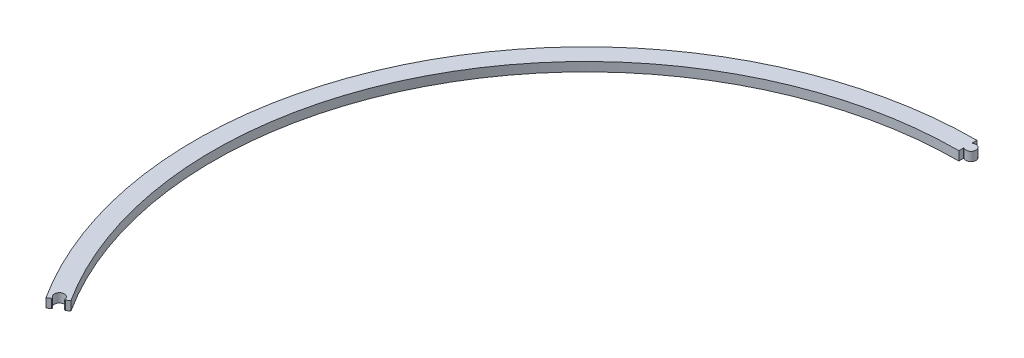
ISO-10303-21;
HEADER;
FILE_DESCRIPTION(('STEP AP214'),'2;1');
FILE_NAME('part.step','',(''),(''),'','','');
FILE_SCHEMA(('AUTOMOTIVE_DESIGN { 1 0 10303 214 1 1 1 1 }'));
ENDSEC;
DATA;
#1=APPLICATION_CONTEXT('core data for automotive mechanical design processes');
#2=APPLICATION_PROTOCOL_DEFINITION('international standard','automotive_design',2000,#1);
#3=PRODUCT_CONTEXT('',#1,'mechanical');
#4=PRODUCT('Part','Part','',(#3));
#5=PRODUCT_RELATED_PRODUCT_CATEGORY('part','',(#4));
#6=PRODUCT_DEFINITION_FORMATION('','',#4);
#7=PRODUCT_DEFINITION_CONTEXT('part definition',#1,'design');
#8=PRODUCT_DEFINITION('design','',#6,#7);
#9=PRODUCT_DEFINITION_SHAPE('','',#8);
#10=(LENGTH_UNIT() NAMED_UNIT(*) SI_UNIT(.MILLI.,.METRE.));
#11=(NAMED_UNIT(*) PLANE_ANGLE_UNIT() SI_UNIT($,.RADIAN.));
#12=(NAMED_UNIT(*) SI_UNIT($,.STERADIAN.) SOLID_ANGLE_UNIT());
#13=UNCERTAINTY_MEASURE_WITH_UNIT(LENGTH_MEASURE(1.E-05),#10,'distance_accuracy_value','');
#14=(GEOMETRIC_REPRESENTATION_CONTEXT(3) GLOBAL_UNCERTAINTY_ASSIGNED_CONTEXT((#13)) GLOBAL_UNIT_ASSIGNED_CONTEXT((#10,
#11,#12)) REPRESENTATION_CONTEXT('',''));
#15=CARTESIAN_POINT('',(0.,0.,0.));
#16=DIRECTION('',(0.,0.,1.));
#17=DIRECTION('',(1.,0.,0.));
#18=AXIS2_PLACEMENT_3D('',#15,#16,#17);
#19=CARTESIAN_POINT('',(0.,2.5,0.));
#20=DIRECTION('',(0.,-1.,0.));
#21=DIRECTION('',(0.,0.,-1.));
#22=AXIS2_PLACEMENT_3D('',#19,#20,#21);
#23=CYLINDRICAL_SURFACE('',#22,103.6);
#24=CARTESIAN_POINT('',(0.,0.,0.));
#25=DIRECTION('',(0.,-1.,0.));
#26=DIRECTION('',(0.,0.,1.));
#27=AXIS2_PLACEMENT_3D('',#24,#25,#26);
#28=CIRCLE('',#27,103.6);
#29=CARTESIAN_POINT('',(-87.2411276502081,0.,55.8743737890654));
#30=VERTEX_POINT('',#29);
#31=CARTESIAN_POINT('',(0.,0.,-103.6));
#32=VERTEX_POINT('',#31);
#33=EDGE_CURVE('E140',#30,#32,#28,.T.);
#34=ORIENTED_EDGE('',*,*,#33,.T.);
#35=DIRECTION('',(0.,-1.,0.));
#36=VECTOR('',#35,1.);
#37=CARTESIAN_POINT('',(0.,2.5,-103.6));
#38=LINE('',#37,#36);
#39=CARTESIAN_POINT('',(0.,2.5,-103.6));
#40=VERTEX_POINT('',#39);
#41=EDGE_CURVE('E122',#40,#32,#38,.T.);
#42=ORIENTED_EDGE('',*,*,#41,.F.);
#43=CARTESIAN_POINT('',(0.,2.5,0.));
#44=DIRECTION('',(0.,-1.,0.));
#45=DIRECTION('',(0.,0.,1.));
#46=AXIS2_PLACEMENT_3D('',#43,#44,#45);
#47=CIRCLE('',#46,103.6);
#48=CARTESIAN_POINT('',(-87.2411276502081,2.5,55.8743737890654));
#49=VERTEX_POINT('',#48);
#50=EDGE_CURVE('E127',#49,#40,#47,.T.);
#51=ORIENTED_EDGE('',*,*,#50,.F.);
#52=DIRECTION('',(0.,-1.,0.));
#53=VECTOR('',#52,1.);
#54=CARTESIAN_POINT('',(-87.2411276502081,2.5,55.8743737890654));
#55=LINE('',#54,#53);
#56=EDGE_CURVE('E218',#49,#30,#55,.T.);
#57=ORIENTED_EDGE('',*,*,#56,.T.);
#58=EDGE_LOOP('',(#34,#42,#51,#57));
#59=FACE_BOUND('',#58,.T.);
#60=ADVANCED_FACE('F33',(#59),#23,.F.);
#61=CARTESIAN_POINT('',(0.,2.5,-103.6));
#62=DIRECTION('',(-1.,0.,0.));
#63=DIRECTION('',(0.,0.,1.));
#64=AXIS2_PLACEMENT_3D('',#61,#62,#63);
#65=PLANE('',#64);
#66=DIRECTION('',(0.,0.,-1.));
#67=VECTOR('',#66,1.);
#68=CARTESIAN_POINT('',(0.,0.,-103.6));
#69=LINE('',#68,#67);
#70=CARTESIAN_POINT('',(0.,0.,-104.845009960199));
#71=VERTEX_POINT('',#70);
#72=EDGE_CURVE('E203',#32,#71,#69,.T.);
#73=ORIENTED_EDGE('',*,*,#72,.T.);
#74=DIRECTION('',(0.,1.,0.));
#75=VECTOR('',#74,1.);
#76=CARTESIAN_POINT('',(0.,2.5,-104.845009960199));
#77=LINE('',#76,#75);
#78=CARTESIAN_POINT('',(0.,2.5,-104.845009960199));
#79=VERTEX_POINT('',#78);
#80=EDGE_CURVE('E48',#71,#79,#77,.T.);
#81=ORIENTED_EDGE('',*,*,#80,.T.);
#82=DIRECTION('',(0.,0.,-1.));
#83=VECTOR('',#82,1.);
#84=CARTESIAN_POINT('',(0.,2.5,-103.6));
#85=LINE('',#84,#83);
#86=EDGE_CURVE('E118',#40,#79,#85,.T.);
#87=ORIENTED_EDGE('',*,*,#86,.F.);
#88=ORIENTED_EDGE('',*,*,#41,.T.);
#89=EDGE_LOOP('',(#73,#81,#87,#88));
#90=FACE_BOUND('',#89,.T.);
#91=ADVANCED_FACE('F120',(#90),#65,.F.);
#92=CARTESIAN_POINT('',(0.875,2.5,-106.1));
#93=DIRECTION('',(0.,-1.,0.));
#94=DIRECTION('',(0.,0.,-1.));
#95=AXIS2_PLACEMENT_3D('',#92,#93,#94);
#96=CYLINDRICAL_SURFACE('',#95,1.37499999999999);
#97=CARTESIAN_POINT('',(0.875,0.,-106.1));
#98=DIRECTION('',(0.,1.,0.));
#99=DIRECTION('',(0.,0.,1.));
#100=AXIS2_PLACEMENT_3D('',#97,#98,#99);
#101=CIRCLE('',#100,1.37499999999999);
#102=CARTESIAN_POINT('',(0.152542372881357,0.,-104.930094030694));
#103=VERTEX_POINT('',#102);
#104=CARTESIAN_POINT('',(0.152542372881357,0.,-107.269905969306));
#105=VERTEX_POINT('',#104);
#106=EDGE_CURVE('E197',#103,#105,#101,.T.);
#107=ORIENTED_EDGE('',*,*,#106,.T.);
#108=DIRECTION('',(0.,-1.,0.));
#109=VECTOR('',#108,1.);
#110=CARTESIAN_POINT('',(0.152542372881358,2.5,-107.269905969306));
#111=LINE('',#110,#109);
#112=CARTESIAN_POINT('',(0.152542372881357,2.5,-107.269905969306));
#113=VERTEX_POINT('',#112);
#114=EDGE_CURVE('E172',#105,#113,#111,.F.);
#115=ORIENTED_EDGE('',*,*,#114,.T.);
#116=CARTESIAN_POINT('',(0.875,2.5,-106.1));
#117=DIRECTION('',(0.,1.,0.));
#118=DIRECTION('',(0.,0.,1.));
#119=AXIS2_PLACEMENT_3D('',#116,#117,#118);
#120=CIRCLE('',#119,1.37499999999999);
#121=CARTESIAN_POINT('',(0.152542372881357,2.5,-104.930094030694));
#122=VERTEX_POINT('',#121);
#123=EDGE_CURVE('E126',#122,#113,#120,.T.);
#124=ORIENTED_EDGE('',*,*,#123,.F.);
#125=DIRECTION('',(0.,-1.,0.));
#126=VECTOR('',#125,1.);
#127=CARTESIAN_POINT('',(0.152542372881358,2.5,-104.930094030694));
#128=LINE('',#127,#126);
#129=EDGE_CURVE('E169',#122,#103,#128,.T.);
#130=ORIENTED_EDGE('',*,*,#129,.T.);
#131=EDGE_LOOP('',(#107,#115,#124,#130));
#132=FACE_BOUND('',#131,.T.);
#133=ADVANCED_FACE('F201',(#132),#96,.T.);
#134=CARTESIAN_POINT('',(0.,2.5,-107.16066017178));
#135=DIRECTION('',(-1.,0.,0.));
#136=DIRECTION('',(0.,0.,1.));
#137=AXIS2_PLACEMENT_3D('',#134,#135,#136);
#138=PLANE('',#137);
#139=DIRECTION('',(0.,0.,-1.));
#140=VECTOR('',#139,1.);
#141=CARTESIAN_POINT('',(0.,2.5,-107.16066017178));
#142=LINE('',#141,#140);
#143=CARTESIAN_POINT('',(0.,2.5,-107.354990039801));
#144=VERTEX_POINT('',#143);
#145=CARTESIAN_POINT('',(0.,2.5,-108.6));
#146=VERTEX_POINT('',#145);
#147=EDGE_CURVE('E181',#144,#146,#142,.T.);
#148=ORIENTED_EDGE('',*,*,#147,.F.);
#149=DIRECTION('',(0.,1.,0.));
#150=VECTOR('',#149,1.);
#151=CARTESIAN_POINT('',(0.,0.,-107.354990039801));
#152=LINE('',#151,#150);
#153=CARTESIAN_POINT('',(0.,0.,-107.354990039801));
#154=VERTEX_POINT('',#153);
#155=EDGE_CURVE('E166',#144,#154,#152,.F.);
#156=ORIENTED_EDGE('',*,*,#155,.T.);
#157=DIRECTION('',(0.,0.,-1.));
#158=VECTOR('',#157,1.);
#159=CARTESIAN_POINT('',(0.,0.,-107.16066017178));
#160=LINE('',#159,#158);
#161=CARTESIAN_POINT('',(0.,0.,-108.6));
#162=VERTEX_POINT('',#161);
#163=EDGE_CURVE('E199',#154,#162,#160,.T.);
#164=ORIENTED_EDGE('',*,*,#163,.T.);
#165=DIRECTION('',(0.,-1.,0.));
#166=VECTOR('',#165,1.);
#167=CARTESIAN_POINT('',(0.,2.5,-108.6));
#168=LINE('',#167,#166);
#169=EDGE_CURVE('E142',#146,#162,#168,.T.);
#170=ORIENTED_EDGE('',*,*,#169,.F.);
#171=EDGE_LOOP('',(#148,#156,#164,#170));
#172=FACE_BOUND('',#171,.T.);
#173=ADVANCED_FACE('F188',(#172),#138,.F.);
#174=CARTESIAN_POINT('',(0.,2.5,0.));
#175=DIRECTION('',(0.,-1.,0.));
#176=DIRECTION('',(0.,0.,-1.));
#177=AXIS2_PLACEMENT_3D('',#174,#175,#176);
#178=CYLINDRICAL_SURFACE('',#177,108.6);
#179=CARTESIAN_POINT('',(0.,0.,0.));
#180=DIRECTION('',(0.,1.,0.));
#181=DIRECTION('',(0.,0.,1.));
#182=AXIS2_PLACEMENT_3D('',#179,#180,#181);
#183=CIRCLE('',#182,108.6);
#184=CARTESIAN_POINT('',(-91.4516067839046,0.,58.5710134506993));
#185=VERTEX_POINT('',#184);
#186=EDGE_CURVE('E205',#162,#185,#183,.T.);
#187=ORIENTED_EDGE('',*,*,#186,.T.);
#188=DIRECTION('',(0.,-1.,0.));
#189=VECTOR('',#188,1.);
#190=CARTESIAN_POINT('',(-91.4516067839046,2.5,58.5710134506993));
#191=LINE('',#190,#189);
#192=CARTESIAN_POINT('',(-91.4516067839046,2.5,58.5710134506993));
#193=VERTEX_POINT('',#192);
#194=EDGE_CURVE('E148',#193,#185,#191,.T.);
#195=ORIENTED_EDGE('',*,*,#194,.F.);
#196=CARTESIAN_POINT('',(0.,2.5,0.));
#197=DIRECTION('',(0.,1.,0.));
#198=DIRECTION('',(0.,0.,1.));
#199=AXIS2_PLACEMENT_3D('',#196,#197,#198);
#200=CIRCLE('',#199,108.6);
#201=EDGE_CURVE('E191',#146,#193,#200,.T.);
#202=ORIENTED_EDGE('',*,*,#201,.F.);
#203=ORIENTED_EDGE('',*,*,#169,.T.);
#204=EDGE_LOOP('',(#187,#195,#202,#203));
#205=FACE_BOUND('',#204,.T.);
#206=ADVANCED_FACE('F245',(#205),#178,.T.);
#207=CARTESIAN_POINT('',(-91.4516067839046,2.5,58.5710134506993));
#208=DIRECTION('',(-0.539327932326875,0.,-0.842095826739462));
#209=DIRECTION('',(-0.842095826739462,0.,0.539327932326875));
#210=AXIS2_PLACEMENT_3D('',#207,#208,#209);
#211=PLANE('',#210);
#212=DIRECTION('',(0.842095826739462,0.,-0.539327932326875));
#213=VECTOR('',#212,1.);
#214=CARTESIAN_POINT('',(-91.4516067839046,0.,58.5710134506993));
#215=LINE('',#214,#213);
#216=CARTESIAN_POINT('',(-90.544690586335,0.,57.9901707222383));
#217=VERTEX_POINT('',#216);
#218=EDGE_CURVE('E211',#185,#217,#215,.T.);
#219=ORIENTED_EDGE('',*,*,#218,.T.);
#220=DIRECTION('',(0.,-1.,0.));
#221=VECTOR('',#220,1.);
#222=CARTESIAN_POINT('',(-90.544690586335,2.5,57.9901707222383));
#223=LINE('',#222,#221);
#224=CARTESIAN_POINT('',(-90.544690586335,2.5,57.9901707222383));
#225=VERTEX_POINT('',#224);
#226=EDGE_CURVE('E164',#217,#225,#223,.F.);
#227=ORIENTED_EDGE('',*,*,#226,.T.);
#228=DIRECTION('',(0.842095826739462,0.,-0.539327932326875));
#229=VECTOR('',#228,1.);
#230=CARTESIAN_POINT('',(-91.4516067839046,2.5,58.5710134506993));
#231=LINE('',#230,#229);
#232=EDGE_CURVE('E227',#193,#225,#231,.T.);
#233=ORIENTED_EDGE('',*,*,#232,.F.);
#234=ORIENTED_EDGE('',*,*,#194,.T.);
#235=EDGE_LOOP('',(#219,#227,#233,#234));
#236=FACE_BOUND('',#235,.T.);
#237=ADVANCED_FACE('F224',(#236),#211,.F.);
#238=CARTESIAN_POINT('',(-89.8182791578424,2.5,56.4858597714853));
#239=DIRECTION('',(0.,-1.,0.));
#240=DIRECTION('',(0.,0.,-1.));
#241=AXIS2_PLACEMENT_3D('',#238,#239,#240);
#242=CYLINDRICAL_SURFACE('',#241,1.37500000000002);
#243=CARTESIAN_POINT('',(-89.8182791578424,0.,56.4858597714853));
#244=DIRECTION('',(0.,-1.,0.));
#245=DIRECTION('',(0.,0.,1.));
#246=AXIS2_PLACEMENT_3D('',#243,#244,#245);
#247=CIRCLE('',#246,1.37500000000002);
#248=CARTESIAN_POINT('',(-90.546616234393,0.,57.6521145047755));
#249=VERTEX_POINT('',#248);
#250=CARTESIAN_POINT('',(-88.4543055896207,0.,56.3120751197095));
#251=VERTEX_POINT('',#250);
#252=EDGE_CURVE('E214',#249,#251,#247,.T.);
#253=ORIENTED_EDGE('',*,*,#252,.T.);
#254=DIRECTION('',(0.,-1.,0.));
#255=VECTOR('',#254,1.);
#256=CARTESIAN_POINT('',(-88.4543055896207,2.5,56.3120751197095));
#257=LINE('',#256,#255);
#258=CARTESIAN_POINT('',(-88.4543055896207,2.5,56.3120751197095));
#259=VERTEX_POINT('',#258);
#260=EDGE_CURVE('E158',#251,#259,#257,.F.);
#261=ORIENTED_EDGE('',*,*,#260,.T.);
#262=CARTESIAN_POINT('',(-89.8182791578424,2.5,56.4858597714853));
#263=DIRECTION('',(0.,-1.,0.));
#264=DIRECTION('',(0.,0.,1.));
#265=AXIS2_PLACEMENT_3D('',#262,#263,#264);
#266=CIRCLE('',#265,1.37500000000002);
#267=CARTESIAN_POINT('',(-90.546616234393,2.5,57.6521145047755));
#268=VERTEX_POINT('',#267);
#269=EDGE_CURVE('E238',#268,#259,#266,.T.);
#270=ORIENTED_EDGE('',*,*,#269,.F.);
#271=DIRECTION('',(0.,-1.,0.));
#272=VECTOR('',#271,1.);
#273=CARTESIAN_POINT('',(-90.546616234393,2.5,57.6521145047755));
#274=LINE('',#273,#272);
#275=EDGE_CURVE('E155',#268,#249,#274,.T.);
#276=ORIENTED_EDGE('',*,*,#275,.T.);
#277=EDGE_LOOP('',(#253,#261,#270,#276));
#278=FACE_BOUND('',#277,.T.);
#279=ADVANCED_FACE('F236',(#278),#242,.F.);
#280=CARTESIAN_POINT('',(-88.4531897128118,2.5,56.6506499625349));
#281=DIRECTION('',(-0.539327932326889,0.,-0.842095826739453));
#282=DIRECTION('',(-0.842095826739453,0.,0.539327932326889));
#283=AXIS2_PLACEMENT_3D('',#280,#281,#282);
#284=PLANE('',#283);
#285=DIRECTION('',(0.842095826739453,0.,-0.539327932326889));
#286=VECTOR('',#285,1.);
#287=CARTESIAN_POINT('',(-88.4531897128118,2.5,56.6506499625349));
#288=LINE('',#287,#286);
#289=CARTESIAN_POINT('',(-88.1480438477777,2.5,56.4552165175264));
#290=VERTEX_POINT('',#289);
#291=EDGE_CURVE('E133',#290,#49,#288,.T.);
#292=ORIENTED_EDGE('',*,*,#291,.F.);
#293=DIRECTION('',(0.,-1.,0.));
#294=VECTOR('',#293,1.);
#295=CARTESIAN_POINT('',(-88.1480438477777,2.5,56.4552165175264));
#296=LINE('',#295,#294);
#297=CARTESIAN_POINT('',(-88.1480438477777,0.,56.4552165175264));
#298=VERTEX_POINT('',#297);
#299=EDGE_CURVE('E141',#290,#298,#296,.T.);
#300=ORIENTED_EDGE('',*,*,#299,.T.);
#301=DIRECTION('',(0.842095826739453,0.,-0.539327932326889));
#302=VECTOR('',#301,1.);
#303=CARTESIAN_POINT('',(-88.4531897128118,0.,56.6506499625349));
#304=LINE('',#303,#302);
#305=EDGE_CURVE('E137',#298,#30,#304,.T.);
#306=ORIENTED_EDGE('',*,*,#305,.T.);
#307=ORIENTED_EDGE('',*,*,#56,.F.);
#308=EDGE_LOOP('',(#292,#300,#306,#307));
#309=FACE_BOUND('',#308,.T.);
#310=ADVANCED_FACE('F297',(#309),#284,.F.);
#311=CARTESIAN_POINT('',(0.,2.5,0.));
#312=DIRECTION('',(0.,1.,0.));
#313=DIRECTION('',(0.,0.,1.));
#314=AXIS2_PLACEMENT_3D('',#311,#312,#313);
#315=PLANE('',#314);
#316=ORIENTED_EDGE('',*,*,#269,.T.);
#317=CARTESIAN_POINT('',(-88.2559094342431,2.5,56.2867973521785));
#318=DIRECTION('',(0.,1.,0.));
#319=DIRECTION('',(0.,0.,1.));
#320=AXIS2_PLACEMENT_3D('',#317,#318,#319);
#321=CIRCLE('',#320,0.2);
#322=EDGE_CURVE('E162',#259,#290,#321,.T.);
#323=ORIENTED_EDGE('',*,*,#322,.T.);
#324=ORIENTED_EDGE('',*,*,#291,.T.);
#325=ORIENTED_EDGE('',*,*,#50,.T.);
#326=ORIENTED_EDGE('',*,*,#86,.T.);
#327=CARTESIAN_POINT('',(0.1,2.5,-104.845009960199));
#328=DIRECTION('',(0.,1.,0.));
#329=DIRECTION('',(0.,0.,1.));
#330=AXIS2_PLACEMENT_3D('',#327,#328,#329);
#331=CIRCLE('',#330,0.1);
#332=EDGE_CURVE('E11',#79,#122,#331,.F.);
#333=ORIENTED_EDGE('',*,*,#332,.T.);
#334=ORIENTED_EDGE('',*,*,#123,.T.);
#335=CARTESIAN_POINT('',(0.1,2.5,-107.354990039801));
#336=DIRECTION('',(0.,1.,0.));
#337=DIRECTION('',(0.,0.,1.));
#338=AXIS2_PLACEMENT_3D('',#335,#336,#337);
#339=CIRCLE('',#338,0.1);
#340=EDGE_CURVE('E177',#113,#144,#339,.F.);
#341=ORIENTED_EDGE('',*,*,#340,.T.);
#342=ORIENTED_EDGE('',*,*,#147,.T.);
#343=ORIENTED_EDGE('',*,*,#201,.T.);
#344=ORIENTED_EDGE('',*,*,#232,.T.);
#345=CARTESIAN_POINT('',(-90.6525561728003,2.5,57.8217515568904));
#346=DIRECTION('',(0.,1.,0.));
#347=DIRECTION('',(0.,0.,1.));
#348=AXIS2_PLACEMENT_3D('',#345,#346,#347);
#349=CIRCLE('',#348,0.2);
#350=EDGE_CURVE('E160',#225,#268,#349,.T.);
#351=ORIENTED_EDGE('',*,*,#350,.T.);
#352=EDGE_LOOP('',(#316,#323,#324,#325,#326,#333,#334,#341,#342,#343,#344,#351));
#353=FACE_BOUND('',#352,.T.);
#354=ADVANCED_FACE('F131',(#353),#315,.T.);
#355=CARTESIAN_POINT('',(0.,0.,0.));
#356=DIRECTION('',(0.,1.,0.));
#357=DIRECTION('',(0.,0.,1.));
#358=AXIS2_PLACEMENT_3D('',#355,#356,#357);
#359=PLANE('',#358);
#360=ORIENTED_EDGE('',*,*,#305,.F.);
#361=CARTESIAN_POINT('',(-88.2559094342431,0.,56.2867973521785));
#362=DIRECTION('',(0.,1.,0.));
#363=DIRECTION('',(0.,0.,1.));
#364=AXIS2_PLACEMENT_3D('',#361,#362,#363);
#365=CIRCLE('',#364,0.2);
#366=EDGE_CURVE('E153',#298,#251,#365,.F.);
#367=ORIENTED_EDGE('',*,*,#366,.T.);
#368=ORIENTED_EDGE('',*,*,#252,.F.);
#369=CARTESIAN_POINT('',(-90.6525561728003,0.,57.8217515568904));
#370=DIRECTION('',(0.,1.,0.));
#371=DIRECTION('',(0.,0.,1.));
#372=AXIS2_PLACEMENT_3D('',#369,#370,#371);
#373=CIRCLE('',#372,0.2);
#374=EDGE_CURVE('E145',#249,#217,#373,.F.);
#375=ORIENTED_EDGE('',*,*,#374,.T.);
#376=ORIENTED_EDGE('',*,*,#218,.F.);
#377=ORIENTED_EDGE('',*,*,#186,.F.);
#378=ORIENTED_EDGE('',*,*,#163,.F.);
#379=CARTESIAN_POINT('',(0.1,0.,-107.354990039801));
#380=DIRECTION('',(0.,1.,0.));
#381=DIRECTION('',(0.,0.,1.));
#382=AXIS2_PLACEMENT_3D('',#379,#380,#381);
#383=CIRCLE('',#382,0.1);
#384=EDGE_CURVE('E175',#154,#105,#383,.T.);
#385=ORIENTED_EDGE('',*,*,#384,.T.);
#386=ORIENTED_EDGE('',*,*,#106,.F.);
#387=CARTESIAN_POINT('',(0.1,0.,-104.845009960199));
#388=DIRECTION('',(0.,1.,0.));
#389=DIRECTION('',(0.,0.,1.));
#390=AXIS2_PLACEMENT_3D('',#387,#388,#389);
#391=CIRCLE('',#390,0.1);
#392=EDGE_CURVE('E41',#103,#71,#391,.T.);
#393=ORIENTED_EDGE('',*,*,#392,.T.);
#394=ORIENTED_EDGE('',*,*,#72,.F.);
#395=ORIENTED_EDGE('',*,*,#33,.F.);
#396=EDGE_LOOP('',(#360,#367,#368,#375,#376,#377,#378,#385,#386,#393,#394,#395));
#397=FACE_BOUND('',#396,.T.);
#398=ADVANCED_FACE('F196',(#397),#359,.F.);
#399=CARTESIAN_POINT('',(-88.2559094342431,2.5,56.2867973521785));
#400=DIRECTION('',(0.,-1.,0.));
#401=DIRECTION('',(0.,0.,-1.));
#402=AXIS2_PLACEMENT_3D('',#399,#400,#401);
#403=CYLINDRICAL_SURFACE('',#402,0.2);
#404=ORIENTED_EDGE('',*,*,#322,.F.);
#405=ORIENTED_EDGE('',*,*,#260,.F.);
#406=ORIENTED_EDGE('',*,*,#366,.F.);
#407=ORIENTED_EDGE('',*,*,#299,.F.);
#408=EDGE_LOOP('',(#404,#405,#406,#407));
#409=FACE_BOUND('',#408,.T.);
#410=ADVANCED_FACE('F262',(#409),#403,.T.);
#411=CARTESIAN_POINT('',(-90.6525561728003,2.5,57.8217515568904));
#412=DIRECTION('',(0.,-1.,0.));
#413=DIRECTION('',(0.,0.,-1.));
#414=AXIS2_PLACEMENT_3D('',#411,#412,#413);
#415=CYLINDRICAL_SURFACE('',#414,0.2);
#416=ORIENTED_EDGE('',*,*,#350,.F.);
#417=ORIENTED_EDGE('',*,*,#226,.F.);
#418=ORIENTED_EDGE('',*,*,#374,.F.);
#419=ORIENTED_EDGE('',*,*,#275,.F.);
#420=EDGE_LOOP('',(#416,#417,#418,#419));
#421=FACE_BOUND('',#420,.T.);
#422=ADVANCED_FACE('F233',(#421),#415,.T.);
#423=CARTESIAN_POINT('',(0.1,2.5,-107.354990039801));
#424=DIRECTION('',(0.,-1.,0.));
#425=DIRECTION('',(0.,0.,-1.));
#426=AXIS2_PLACEMENT_3D('',#423,#424,#425);
#427=CYLINDRICAL_SURFACE('',#426,0.1);
#428=ORIENTED_EDGE('',*,*,#340,.F.);
#429=ORIENTED_EDGE('',*,*,#114,.F.);
#430=ORIENTED_EDGE('',*,*,#384,.F.);
#431=ORIENTED_EDGE('',*,*,#155,.F.);
#432=EDGE_LOOP('',(#428,#429,#430,#431));
#433=FACE_BOUND('',#432,.T.);
#434=ADVANCED_FACE('F193',(#433),#427,.F.);
#435=CARTESIAN_POINT('',(0.1,2.5,-104.845009960199));
#436=DIRECTION('',(0.,-1.,0.));
#437=DIRECTION('',(0.,0.,-1.));
#438=AXIS2_PLACEMENT_3D('',#435,#436,#437);
#439=CYLINDRICAL_SURFACE('',#438,0.1);
#440=ORIENTED_EDGE('',*,*,#332,.F.);
#441=ORIENTED_EDGE('',*,*,#80,.F.);
#442=ORIENTED_EDGE('',*,*,#392,.F.);
#443=ORIENTED_EDGE('',*,*,#129,.F.);
#444=EDGE_LOOP('',(#440,#441,#442,#443));
#445=FACE_BOUND('',#444,.T.);
#446=ADVANCED_FACE('F35',(#445),#439,.F.);
#447=CLOSED_SHELL('',(#60,#91,#133,#173,#206,#237,#279,#310,#354,#398,#410,#422,#434,#446));
#448=MANIFOLD_SOLID_BREP('B2',#447);
#449=ADVANCED_BREP_SHAPE_REPRESENTATION('',(#18,#448),#14);
#450=SHAPE_DEFINITION_REPRESENTATION(#9,#449);
ENDSEC;
END-ISO-10303-21;
